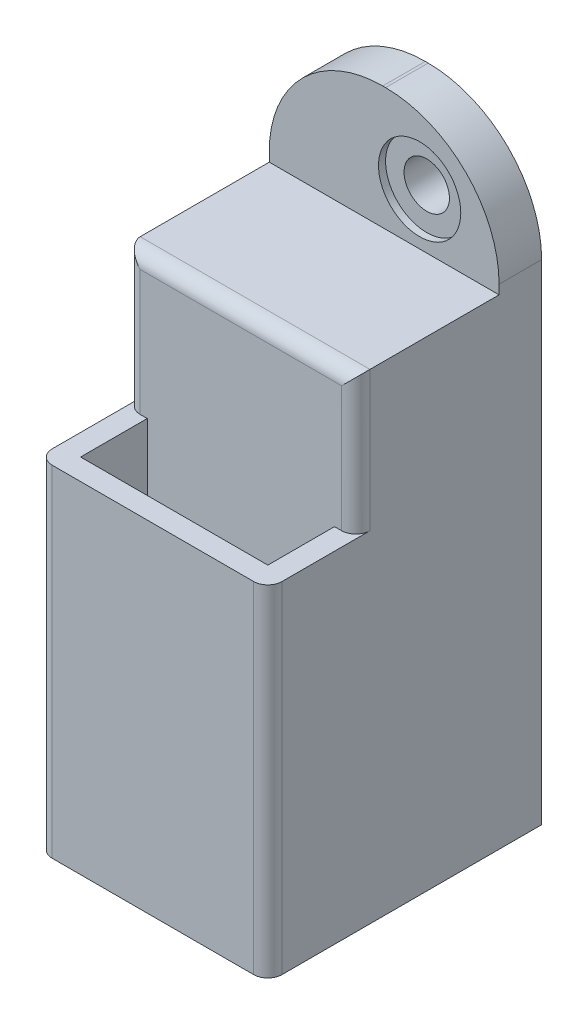
ISO-10303-21;
HEADER;
FILE_DESCRIPTION(('STEP AP214'),'2;1');
FILE_NAME('part.step','',(''),(''),'','','');
FILE_SCHEMA(('AUTOMOTIVE_DESIGN { 1 0 10303 214 1 1 1 1 }'));
ENDSEC;
DATA;
#1=APPLICATION_CONTEXT('core data for automotive mechanical design processes');
#2=APPLICATION_PROTOCOL_DEFINITION('international standard','automotive_design',2000,#1);
#3=PRODUCT_CONTEXT('',#1,'mechanical');
#4=PRODUCT('Part','Part','',(#3));
#5=PRODUCT_RELATED_PRODUCT_CATEGORY('part','',(#4));
#6=PRODUCT_DEFINITION_FORMATION('','',#4);
#7=PRODUCT_DEFINITION_CONTEXT('part definition',#1,'design');
#8=PRODUCT_DEFINITION('design','',#6,#7);
#9=PRODUCT_DEFINITION_SHAPE('','',#8);
#10=(LENGTH_UNIT() NAMED_UNIT(*) SI_UNIT(.MILLI.,.METRE.));
#11=(NAMED_UNIT(*) PLANE_ANGLE_UNIT() SI_UNIT($,.RADIAN.));
#12=(NAMED_UNIT(*) SI_UNIT($,.STERADIAN.) SOLID_ANGLE_UNIT());
#13=UNCERTAINTY_MEASURE_WITH_UNIT(LENGTH_MEASURE(1.E-05),#10,'distance_accuracy_value','');
#14=(GEOMETRIC_REPRESENTATION_CONTEXT(3) GLOBAL_UNCERTAINTY_ASSIGNED_CONTEXT((#13)) GLOBAL_UNIT_ASSIGNED_CONTEXT((#10,
#11,#12)) REPRESENTATION_CONTEXT('',''));
#15=CARTESIAN_POINT('',(0.,0.,0.));
#16=DIRECTION('',(0.,0.,1.));
#17=DIRECTION('',(1.,0.,0.));
#18=AXIS2_PLACEMENT_3D('',#15,#16,#17);
#19=CARTESIAN_POINT('',(0.,0.,-3.5));
#20=DIRECTION('',(0.,0.,-1.));
#21=DIRECTION('',(-1.,0.,0.));
#22=AXIS2_PLACEMENT_3D('',#19,#20,#21);
#23=PLANE('',#22);
#24=DIRECTION('',(0.,-1.,0.));
#25=VECTOR('',#24,1.);
#26=CARTESIAN_POINT('',(0.3,0.,-3.5));
#27=LINE('',#26,#25);
#28=CARTESIAN_POINT('',(0.3,15.,-3.5));
#29=VERTEX_POINT('',#28);
#30=CARTESIAN_POINT('',(0.3,-17.5,-3.5));
#31=VERTEX_POINT('',#30);
#32=EDGE_CURVE('E320',#29,#31,#27,.T.);
#33=ORIENTED_EDGE('',*,*,#32,.F.);
#34=DIRECTION('',(-1.,0.,0.));
#35=VECTOR('',#34,1.);
#36=CARTESIAN_POINT('',(12.9,15.,-3.5));
#37=LINE('',#36,#35);
#38=CARTESIAN_POINT('',(12.9,15.,-3.5));
#39=VERTEX_POINT('',#38);
#40=EDGE_CURVE('E215',#39,#29,#37,.T.);
#41=ORIENTED_EDGE('',*,*,#40,.F.);
#42=DIRECTION('',(0.,1.,0.));
#43=VECTOR('',#42,1.);
#44=CARTESIAN_POINT('',(12.9,11.,-3.5));
#45=LINE('',#44,#43);
#46=CARTESIAN_POINT('',(12.9,-17.5,-3.5));
#47=VERTEX_POINT('',#46);
#48=EDGE_CURVE('E315',#47,#39,#45,.T.);
#49=ORIENTED_EDGE('',*,*,#48,.F.);
#50=DIRECTION('',(1.,0.,0.));
#51=VECTOR('',#50,1.);
#52=CARTESIAN_POINT('',(0.3,-17.5,-3.5));
#53=LINE('',#52,#51);
#54=EDGE_CURVE('E273',#31,#47,#53,.T.);
#55=ORIENTED_EDGE('',*,*,#54,.F.);
#56=EDGE_LOOP('',(#33,#41,#49,#55));
#57=FACE_BOUND('',#56,.T.);
#58=ADVANCED_FACE('F33',(#57),#23,.T.);
#59=CARTESIAN_POINT('',(12.9,11.,-11.6));
#60=DIRECTION('',(1.,0.,0.));
#61=DIRECTION('',(0.,1.,0.));
#62=AXIS2_PLACEMENT_3D('',#59,#60,#61);
#63=PLANE('',#62);
#64=DIRECTION('',(0.,0.,-1.));
#65=VECTOR('',#64,1.);
#66=CARTESIAN_POINT('',(12.9,15.,10.6777995471794));
#67=LINE('',#66,#65);
#68=CARTESIAN_POINT('',(12.9,15.,-11.6));
#69=VERTEX_POINT('',#68);
#70=EDGE_CURVE('E216',#39,#69,#67,.T.);
#71=ORIENTED_EDGE('',*,*,#70,.T.);
#72=DIRECTION('',(0.,1.,0.));
#73=VECTOR('',#72,1.);
#74=CARTESIAN_POINT('',(12.9,11.,-11.6));
#75=LINE('',#74,#73);
#76=CARTESIAN_POINT('',(12.9,-17.5,-11.6));
#77=VERTEX_POINT('',#76);
#78=EDGE_CURVE('E206',#77,#69,#75,.T.);
#79=ORIENTED_EDGE('',*,*,#78,.F.);
#80=DIRECTION('',(0.,0.,-1.));
#81=VECTOR('',#80,1.);
#82=CARTESIAN_POINT('',(12.9,-17.5,-3.5));
#83=LINE('',#82,#81);
#84=EDGE_CURVE('E276',#47,#77,#83,.T.);
#85=ORIENTED_EDGE('',*,*,#84,.F.);
#86=ORIENTED_EDGE('',*,*,#48,.T.);
#87=EDGE_LOOP('',(#71,#79,#85,#86));
#88=FACE_BOUND('',#87,.T.);
#89=ADVANCED_FACE('F491',(#88),#63,.F.);
#90=CARTESIAN_POINT('',(0.3,0.,-11.6));
#91=DIRECTION('',(-1.,0.,0.));
#92=DIRECTION('',(0.,0.,1.));
#93=AXIS2_PLACEMENT_3D('',#90,#91,#92);
#94=PLANE('',#93);
#95=DIRECTION('',(0.,0.,1.));
#96=VECTOR('',#95,1.);
#97=CARTESIAN_POINT('',(0.3,-17.5,-11.6));
#98=LINE('',#97,#96);
#99=CARTESIAN_POINT('',(0.3,-17.5,-11.6));
#100=VERTEX_POINT('',#99);
#101=EDGE_CURVE('E200',#100,#31,#98,.T.);
#102=ORIENTED_EDGE('',*,*,#101,.F.);
#103=DIRECTION('',(0.,-1.,0.));
#104=VECTOR('',#103,1.);
#105=CARTESIAN_POINT('',(0.3,0.,-11.6));
#106=LINE('',#105,#104);
#107=CARTESIAN_POINT('',(0.3,15.,-11.6));
#108=VERTEX_POINT('',#107);
#109=EDGE_CURVE('E195',#108,#100,#106,.T.);
#110=ORIENTED_EDGE('',*,*,#109,.F.);
#111=DIRECTION('',(0.,0.,-1.));
#112=VECTOR('',#111,1.);
#113=CARTESIAN_POINT('',(0.3,15.,10.6777995471794));
#114=LINE('',#113,#112);
#115=EDGE_CURVE('E198',#29,#108,#114,.T.);
#116=ORIENTED_EDGE('',*,*,#115,.F.);
#117=ORIENTED_EDGE('',*,*,#32,.T.);
#118=EDGE_LOOP('',(#102,#110,#116,#117));
#119=FACE_BOUND('',#118,.T.);
#120=ADVANCED_FACE('F197',(#119),#94,.F.);
#121=CARTESIAN_POINT('',(14.7,25.,-8.6));
#122=DIRECTION('',(0.,0.,-1.));
#123=DIRECTION('',(-1.,0.,0.));
#124=AXIS2_PLACEMENT_3D('',#121,#122,#123);
#125=PLANE('',#124);
#126=CARTESIAN_POINT('',(9.1,20.,-8.6));
#127=DIRECTION('',(0.,0.,1.));
#128=DIRECTION('',(1.,0.,0.));
#129=AXIS2_PLACEMENT_3D('',#126,#127,#128);
#130=CIRCLE('',#129,2.9);
#131=CARTESIAN_POINT('',(12.,20.,-8.6));
#132=VERTEX_POINT('',#131);
#133=EDGE_CURVE('E290',#132,#132,#130,.T.);
#134=ORIENTED_EDGE('',*,*,#133,.F.);
#135=EDGE_LOOP('',(#134));
#136=FACE_BOUND('',#135,.T.);
#137=DIRECTION('',(-1.,0.,0.));
#138=VECTOR('',#137,1.);
#139=CARTESIAN_POINT('',(14.7,16.35,-8.6));
#140=LINE('',#139,#138);
#141=CARTESIAN_POINT('',(14.7,16.35,-8.6));
#142=VERTEX_POINT('',#141);
#143=CARTESIAN_POINT('',(-1.5,16.35,-8.6));
#144=VERTEX_POINT('',#143);
#145=EDGE_CURVE('E227',#142,#144,#140,.T.);
#146=ORIENTED_EDGE('',*,*,#145,.F.);
#147=DIRECTION('',(0.,-1.,0.));
#148=VECTOR('',#147,1.);
#149=CARTESIAN_POINT('',(14.7,25.,-8.6));
#150=LINE('',#149,#148);
#151=CARTESIAN_POINT('',(14.7,17.,-8.6));
#152=VERTEX_POINT('',#151);
#153=EDGE_CURVE('E309',#152,#142,#150,.T.);
#154=ORIENTED_EDGE('',*,*,#153,.F.);
#155=CARTESIAN_POINT('',(6.7,17.,-8.6));
#156=DIRECTION('',(0.,0.,-1.));
#157=DIRECTION('',(-1.,0.,0.));
#158=AXIS2_PLACEMENT_3D('',#155,#156,#157);
#159=CIRCLE('',#158,8.);
#160=CARTESIAN_POINT('',(6.7,25.,-8.6));
#161=VERTEX_POINT('',#160);
#162=EDGE_CURVE('E372',#152,#161,#159,.F.);
#163=ORIENTED_EDGE('',*,*,#162,.T.);
#164=DIRECTION('',(1.,0.,0.));
#165=VECTOR('',#164,1.);
#166=CARTESIAN_POINT('',(14.7,25.,-8.6));
#167=LINE('',#166,#165);
#168=CARTESIAN_POINT('',(6.5,25.,-8.6));
#169=VERTEX_POINT('',#168);
#170=EDGE_CURVE('E306',#169,#161,#167,.T.);
#171=ORIENTED_EDGE('',*,*,#170,.F.);
#172=CARTESIAN_POINT('',(6.5,17.,-8.6));
#173=DIRECTION('',(0.,0.,-1.));
#174=DIRECTION('',(-1.,0.,0.));
#175=AXIS2_PLACEMENT_3D('',#172,#173,#174);
#176=CIRCLE('',#175,8.);
#177=CARTESIAN_POINT('',(-1.5,17.,-8.6));
#178=VERTEX_POINT('',#177);
#179=EDGE_CURVE('E370',#169,#178,#176,.F.);
#180=ORIENTED_EDGE('',*,*,#179,.T.);
#181=DIRECTION('',(0.,-1.,0.));
#182=VECTOR('',#181,1.);
#183=CARTESIAN_POINT('',(-1.5,25.,-8.6));
#184=LINE('',#183,#182);
#185=EDGE_CURVE('E312',#178,#144,#184,.T.);
#186=ORIENTED_EDGE('',*,*,#185,.T.);
#187=EDGE_LOOP('',(#146,#154,#163,#171,#180,#186));
#188=FACE_BOUND('',#187,.T.);
#189=ADVANCED_FACE('F419',(#136,#188),#125,.F.);
#190=CARTESIAN_POINT('',(0.,6.5,0.));
#191=DIRECTION('',(1.,0.,0.));
#192=DIRECTION('',(0.,0.,-1.));
#193=AXIS2_PLACEMENT_3D('',#190,#191,#192);
#194=PLANE('',#193);
#195=DIRECTION('',(0.,0.,-1.));
#196=VECTOR('',#195,1.);
#197=CARTESIAN_POINT('',(0.,-11.,1.5));
#198=LINE('',#197,#196);
#199=CARTESIAN_POINT('',(0.,-11.,1.5));
#200=VERTEX_POINT('',#199);
#201=CARTESIAN_POINT('',(0.,-11.,0.));
#202=VERTEX_POINT('',#201);
#203=EDGE_CURVE('E240',#200,#202,#198,.T.);
#204=ORIENTED_EDGE('',*,*,#203,.F.);
#205=DIRECTION('',(0.,1.,0.));
#206=VECTOR('',#205,1.);
#207=CARTESIAN_POINT('',(0.,3.,1.5));
#208=LINE('',#207,#206);
#209=CARTESIAN_POINT('',(0.,6.5,1.5));
#210=VERTEX_POINT('',#209);
#211=EDGE_CURVE('E287',#200,#210,#208,.T.);
#212=ORIENTED_EDGE('',*,*,#211,.T.);
#213=DIRECTION('',(0.,0.,1.));
#214=VECTOR('',#213,1.);
#215=CARTESIAN_POINT('',(0.,6.5,0.));
#216=LINE('',#215,#214);
#217=CARTESIAN_POINT('',(0.,6.5,6.2));
#218=VERTEX_POINT('',#217);
#219=EDGE_CURVE('E205',#210,#218,#216,.T.);
#220=ORIENTED_EDGE('',*,*,#219,.T.);
#221=DIRECTION('',(0.,-1.,0.));
#222=VECTOR('',#221,1.);
#223=CARTESIAN_POINT('',(0.,6.5,6.2));
#224=LINE('',#223,#222);
#225=CARTESIAN_POINT('',(0.,-17.5,6.2));
#226=VERTEX_POINT('',#225);
#227=EDGE_CURVE('E337',#218,#226,#224,.T.);
#228=ORIENTED_EDGE('',*,*,#227,.T.);
#229=DIRECTION('',(0.,0.,-1.));
#230=VECTOR('',#229,1.);
#231=CARTESIAN_POINT('',(0.,-17.5,6.2));
#232=LINE('',#231,#230);
#233=CARTESIAN_POINT('',(0.,-17.5,0.));
#234=VERTEX_POINT('',#233);
#235=EDGE_CURVE('E249',#226,#234,#232,.T.);
#236=ORIENTED_EDGE('',*,*,#235,.T.);
#237=DIRECTION('',(0.,-1.,0.));
#238=VECTOR('',#237,1.);
#239=CARTESIAN_POINT('',(0.,6.5,0.));
#240=LINE('',#239,#238);
#241=EDGE_CURVE('E331',#202,#234,#240,.T.);
#242=ORIENTED_EDGE('',*,*,#241,.F.);
#243=EDGE_LOOP('',(#204,#212,#220,#228,#236,#242));
#244=FACE_BOUND('',#243,.T.);
#245=ADVANCED_FACE('F461',(#244),#194,.T.);
#246=CARTESIAN_POINT('',(13.2,6.5,0.));
#247=DIRECTION('',(-1.,0.,0.));
#248=DIRECTION('',(0.,0.,1.));
#249=AXIS2_PLACEMENT_3D('',#246,#247,#248);
#250=PLANE('',#249);
#251=DIRECTION('',(0.,1.,0.));
#252=VECTOR('',#251,1.);
#253=CARTESIAN_POINT('',(13.2,3.,1.5));
#254=LINE('',#253,#252);
#255=CARTESIAN_POINT('',(13.2,-11.,1.5));
#256=VERTEX_POINT('',#255);
#257=CARTESIAN_POINT('',(13.2,6.5,1.5));
#258=VERTEX_POINT('',#257);
#259=EDGE_CURVE('E285',#256,#258,#254,.T.);
#260=ORIENTED_EDGE('',*,*,#259,.F.);
#261=DIRECTION('',(0.,0.,1.));
#262=VECTOR('',#261,1.);
#263=CARTESIAN_POINT('',(13.2,-11.,0.));
#264=LINE('',#263,#262);
#265=CARTESIAN_POINT('',(13.2,-11.,0.));
#266=VERTEX_POINT('',#265);
#267=EDGE_CURVE('E234',#266,#256,#264,.T.);
#268=ORIENTED_EDGE('',*,*,#267,.F.);
#269=DIRECTION('',(0.,-1.,0.));
#270=VECTOR('',#269,1.);
#271=CARTESIAN_POINT('',(13.2,6.5,0.));
#272=LINE('',#271,#270);
#273=CARTESIAN_POINT('',(13.2,-17.5,0.));
#274=VERTEX_POINT('',#273);
#275=EDGE_CURVE('E333',#266,#274,#272,.T.);
#276=ORIENTED_EDGE('',*,*,#275,.T.);
#277=DIRECTION('',(0.,0.,1.));
#278=VECTOR('',#277,1.);
#279=CARTESIAN_POINT('',(13.2,-17.5,0.));
#280=LINE('',#279,#278);
#281=CARTESIAN_POINT('',(13.2,-17.5,6.2));
#282=VERTEX_POINT('',#281);
#283=EDGE_CURVE('E255',#274,#282,#280,.T.);
#284=ORIENTED_EDGE('',*,*,#283,.T.);
#285=DIRECTION('',(0.,-1.,0.));
#286=VECTOR('',#285,1.);
#287=CARTESIAN_POINT('',(13.2,6.5,6.2));
#288=LINE('',#287,#286);
#289=CARTESIAN_POINT('',(13.2,6.5,6.2));
#290=VERTEX_POINT('',#289);
#291=EDGE_CURVE('E335',#290,#282,#288,.T.);
#292=ORIENTED_EDGE('',*,*,#291,.F.);
#293=DIRECTION('',(0.,0.,-1.));
#294=VECTOR('',#293,1.);
#295=CARTESIAN_POINT('',(13.2,6.5,0.));
#296=LINE('',#295,#294);
#297=EDGE_CURVE('E328',#290,#258,#296,.T.);
#298=ORIENTED_EDGE('',*,*,#297,.T.);
#299=EDGE_LOOP('',(#260,#268,#276,#284,#292,#298));
#300=FACE_BOUND('',#299,.T.);
#301=ADVANCED_FACE('F469',(#300),#250,.T.);
#302=CARTESIAN_POINT('',(9.1,20.,-16.1254833995939));
#303=DIRECTION('',(0.,0.,1.));
#304=DIRECTION('',(1.,0.,0.));
#305=AXIS2_PLACEMENT_3D('',#302,#303,#304);
#306=CYLINDRICAL_SURFACE('',#305,1.6);
#307=CARTESIAN_POINT('',(9.1,20.,-11.6));
#308=DIRECTION('',(0.,0.,1.));
#309=DIRECTION('',(1.,0.,0.));
#310=AXIS2_PLACEMENT_3D('',#307,#308,#309);
#311=CIRCLE('',#310,1.6);
#312=CARTESIAN_POINT('',(10.7,20.,-11.6));
#313=VERTEX_POINT('',#312);
#314=EDGE_CURVE('E299',#313,#313,#311,.F.);
#315=ORIENTED_EDGE('',*,*,#314,.T.);
#316=EDGE_LOOP('',(#315));
#317=FACE_BOUND('',#316,.T.);
#318=CARTESIAN_POINT('',(9.1,20.,-9.1));
#319=DIRECTION('',(0.,0.,1.));
#320=DIRECTION('',(1.,0.,0.));
#321=AXIS2_PLACEMENT_3D('',#318,#319,#320);
#322=CIRCLE('',#321,1.6);
#323=CARTESIAN_POINT('',(10.7,20.,-9.1));
#324=VERTEX_POINT('',#323);
#325=EDGE_CURVE('E294',#324,#324,#322,.F.);
#326=ORIENTED_EDGE('',*,*,#325,.F.);
#327=EDGE_LOOP('',(#326));
#328=FACE_BOUND('',#327,.T.);
#329=ADVANCED_FACE('F506',(#317,#328),#306,.F.);
#330=CARTESIAN_POINT('',(0.,6.5,0.));
#331=DIRECTION('',(0.,1.,0.));
#332=DIRECTION('',(0.,0.,1.));
#333=AXIS2_PLACEMENT_3D('',#330,#331,#332);
#334=PLANE('',#333);
#335=DIRECTION('',(0.,0.,1.));
#336=VECTOR('',#335,1.);
#337=CARTESIAN_POINT('',(-1.5,6.5,-1.5));
#338=LINE('',#337,#336);
#339=CARTESIAN_POINT('',(-1.5,6.5,0.5));
#340=VERTEX_POINT('',#339);
#341=CARTESIAN_POINT('',(-1.5,6.5,6.7));
#342=VERTEX_POINT('',#341);
#343=EDGE_CURVE('E57',#340,#342,#338,.T.);
#344=ORIENTED_EDGE('',*,*,#343,.T.);
#345=CARTESIAN_POINT('',(-0.5,6.5,6.7));
#346=DIRECTION('',(0.,1.,0.));
#347=DIRECTION('',(0.,0.,1.));
#348=AXIS2_PLACEMENT_3D('',#345,#346,#347);
#349=CIRCLE('',#348,1.);
#350=CARTESIAN_POINT('',(-0.5,6.5,7.7));
#351=VERTEX_POINT('',#350);
#352=EDGE_CURVE('E354',#342,#351,#349,.T.);
#353=ORIENTED_EDGE('',*,*,#352,.T.);
#354=DIRECTION('',(1.,0.,0.));
#355=VECTOR('',#354,1.);
#356=CARTESIAN_POINT('',(-1.5,6.5,7.7));
#357=LINE('',#356,#355);
#358=CARTESIAN_POINT('',(13.7,6.5,7.7));
#359=VERTEX_POINT('',#358);
#360=EDGE_CURVE('E340',#351,#359,#357,.T.);
#361=ORIENTED_EDGE('',*,*,#360,.T.);
#362=CARTESIAN_POINT('',(13.7,6.5,6.7));
#363=DIRECTION('',(0.,1.,0.));
#364=DIRECTION('',(0.,0.,1.));
#365=AXIS2_PLACEMENT_3D('',#362,#363,#364);
#366=CIRCLE('',#365,1.);
#367=CARTESIAN_POINT('',(14.7,6.5,6.7));
#368=VERTEX_POINT('',#367);
#369=EDGE_CURVE('E352',#359,#368,#366,.T.);
#370=ORIENTED_EDGE('',*,*,#369,.T.);
#371=DIRECTION('',(0.,0.,-1.));
#372=VECTOR('',#371,1.);
#373=CARTESIAN_POINT('',(14.7,6.5,-1.5));
#374=LINE('',#373,#372);
#375=CARTESIAN_POINT('',(14.7,6.5,0.5));
#376=VERTEX_POINT('',#375);
#377=EDGE_CURVE('E49',#368,#376,#374,.T.);
#378=ORIENTED_EDGE('',*,*,#377,.T.);
#379=CARTESIAN_POINT('',(13.7,6.5,0.5));
#380=DIRECTION('',(0.,1.,0.));
#381=DIRECTION('',(0.,0.,1.));
#382=AXIS2_PLACEMENT_3D('',#379,#380,#381);
#383=CIRCLE('',#382,1.);
#384=CARTESIAN_POINT('',(13.7,6.5,1.5));
#385=VERTEX_POINT('',#384);
#386=EDGE_CURVE('E11',#376,#385,#383,.F.);
#387=ORIENTED_EDGE('',*,*,#386,.T.);
#388=DIRECTION('',(1.,0.,0.));
#389=VECTOR('',#388,1.);
#390=CARTESIAN_POINT('',(14.7,6.5,1.5));
#391=LINE('',#390,#389);
#392=EDGE_CURVE('E300',#258,#385,#391,.T.);
#393=ORIENTED_EDGE('',*,*,#392,.F.);
#394=ORIENTED_EDGE('',*,*,#297,.F.);
#395=DIRECTION('',(1.,0.,0.));
#396=VECTOR('',#395,1.);
#397=CARTESIAN_POINT('',(0.,6.5,6.2));
#398=LINE('',#397,#396);
#399=EDGE_CURVE('E326',#218,#290,#398,.T.);
#400=ORIENTED_EDGE('',*,*,#399,.F.);
#401=ORIENTED_EDGE('',*,*,#219,.F.);
#402=CARTESIAN_POINT('',(-0.5,6.5,1.5));
#403=VERTEX_POINT('',#402);
#404=EDGE_CURVE('E297',#403,#210,#391,.T.);
#405=ORIENTED_EDGE('',*,*,#404,.F.);
#406=CARTESIAN_POINT('',(-0.5,6.5,0.5));
#407=DIRECTION('',(0.,1.,0.));
#408=DIRECTION('',(0.,0.,1.));
#409=AXIS2_PLACEMENT_3D('',#406,#407,#408);
#410=CIRCLE('',#409,1.);
#411=EDGE_CURVE('E42',#403,#340,#410,.F.);
#412=ORIENTED_EDGE('',*,*,#411,.T.);
#413=EDGE_LOOP('',(#344,#353,#361,#370,#378,#387,#393,#394,#400,#401,#405,#412));
#414=FACE_BOUND('',#413,.T.);
#415=ADVANCED_FACE('F455',(#414),#334,.T.);
#416=CARTESIAN_POINT('',(-1.5,6.5,-1.5));
#417=DIRECTION('',(1.,0.,0.));
#418=DIRECTION('',(0.,0.,-1.));
#419=AXIS2_PLACEMENT_3D('',#416,#417,#418);
#420=PLANE('',#419);
#421=ORIENTED_EDGE('',*,*,#343,.F.);
#422=DIRECTION('',(0.,-1.,0.));
#423=VECTOR('',#422,1.);
#424=CARTESIAN_POINT('',(-1.5,16.35,0.5));
#425=LINE('',#424,#423);
#426=CARTESIAN_POINT('',(-1.5,16.35,0.5));
#427=VERTEX_POINT('',#426);
#428=EDGE_CURVE('E385',#340,#427,#425,.F.);
#429=ORIENTED_EDGE('',*,*,#428,.T.);
#430=DIRECTION('',(0.,0.,-1.));
#431=VECTOR('',#430,1.);
#432=CARTESIAN_POINT('',(-1.5,16.35,19.5017360273947));
#433=LINE('',#432,#431);
#434=EDGE_CURVE('E230',#427,#144,#433,.T.);
#435=ORIENTED_EDGE('',*,*,#434,.T.);
#436=ORIENTED_EDGE('',*,*,#185,.F.);
#437=DIRECTION('',(0.,0.,1.));
#438=VECTOR('',#437,1.);
#439=CARTESIAN_POINT('',(-1.5,17.,-1.5));
#440=LINE('',#439,#438);
#441=CARTESIAN_POINT('',(-1.5,17.,-11.6));
#442=VERTEX_POINT('',#441);
#443=EDGE_CURVE('E374',#178,#442,#440,.F.);
#444=ORIENTED_EDGE('',*,*,#443,.T.);
#445=DIRECTION('',(0.,1.,0.));
#446=VECTOR('',#445,1.);
#447=CARTESIAN_POINT('',(-1.5,0.,-11.6));
#448=LINE('',#447,#446);
#449=CARTESIAN_POINT('',(-1.5,-17.5,-11.6));
#450=VERTEX_POINT('',#449);
#451=EDGE_CURVE('E316',#450,#442,#448,.T.);
#452=ORIENTED_EDGE('',*,*,#451,.F.);
#453=DIRECTION('',(0.,0.,-1.));
#454=VECTOR('',#453,1.);
#455=CARTESIAN_POINT('',(-1.5,-17.5,6.7));
#456=LINE('',#455,#454);
#457=CARTESIAN_POINT('',(-1.5,-17.5,6.7));
#458=VERTEX_POINT('',#457);
#459=EDGE_CURVE('E267',#458,#450,#456,.T.);
#460=ORIENTED_EDGE('',*,*,#459,.F.);
#461=DIRECTION('',(0.,-1.,0.));
#462=VECTOR('',#461,1.);
#463=CARTESIAN_POINT('',(-1.5,6.5,6.7));
#464=LINE('',#463,#462);
#465=EDGE_CURVE('E350',#458,#342,#464,.F.);
#466=ORIENTED_EDGE('',*,*,#465,.T.);
#467=EDGE_LOOP('',(#421,#429,#435,#436,#444,#452,#460,#466));
#468=FACE_BOUND('',#467,.T.);
#469=ADVANCED_FACE('F424',(#468),#420,.F.);
#470=CARTESIAN_POINT('',(-1.5,6.5,7.7));
#471=DIRECTION('',(0.,0.,-1.));
#472=DIRECTION('',(-1.,0.,0.));
#473=AXIS2_PLACEMENT_3D('',#470,#471,#472);
#474=PLANE('',#473);
#475=ORIENTED_EDGE('',*,*,#360,.F.);
#476=DIRECTION('',(0.,-1.,0.));
#477=VECTOR('',#476,1.);
#478=CARTESIAN_POINT('',(-0.5,6.5,7.7));
#479=LINE('',#478,#477);
#480=CARTESIAN_POINT('',(-0.5,-17.5,7.7));
#481=VERTEX_POINT('',#480);
#482=EDGE_CURVE('E348',#351,#481,#479,.T.);
#483=ORIENTED_EDGE('',*,*,#482,.T.);
#484=DIRECTION('',(-1.,0.,0.));
#485=VECTOR('',#484,1.);
#486=CARTESIAN_POINT('',(13.7,-17.5,7.7));
#487=LINE('',#486,#485);
#488=CARTESIAN_POINT('',(13.7,-17.5,7.7));
#489=VERTEX_POINT('',#488);
#490=EDGE_CURVE('E261',#489,#481,#487,.T.);
#491=ORIENTED_EDGE('',*,*,#490,.F.);
#492=DIRECTION('',(0.,-1.,0.));
#493=VECTOR('',#492,1.);
#494=CARTESIAN_POINT('',(13.7,6.5,7.7));
#495=LINE('',#494,#493);
#496=EDGE_CURVE('E344',#489,#359,#495,.F.);
#497=ORIENTED_EDGE('',*,*,#496,.T.);
#498=EDGE_LOOP('',(#475,#483,#491,#497));
#499=FACE_BOUND('',#498,.T.);
#500=ADVANCED_FACE('F448',(#499),#474,.F.);
#501=CARTESIAN_POINT('',(14.7,6.5,-1.5));
#502=DIRECTION('',(-1.,0.,0.));
#503=DIRECTION('',(0.,0.,1.));
#504=AXIS2_PLACEMENT_3D('',#501,#502,#503);
#505=PLANE('',#504);
#506=DIRECTION('',(0.,0.,-1.));
#507=VECTOR('',#506,1.);
#508=CARTESIAN_POINT('',(14.7,16.35,19.5017360273947));
#509=LINE('',#508,#507);
#510=CARTESIAN_POINT('',(14.7,16.35,0.5));
#511=VERTEX_POINT('',#510);
#512=EDGE_CURVE('E231',#511,#142,#509,.T.);
#513=ORIENTED_EDGE('',*,*,#512,.F.);
#514=DIRECTION('',(0.,1.,0.));
#515=VECTOR('',#514,1.);
#516=CARTESIAN_POINT('',(14.7,6.5,0.5));
#517=LINE('',#516,#515);
#518=EDGE_CURVE('E387',#511,#376,#517,.F.);
#519=ORIENTED_EDGE('',*,*,#518,.T.);
#520=ORIENTED_EDGE('',*,*,#377,.F.);
#521=DIRECTION('',(0.,-1.,0.));
#522=VECTOR('',#521,1.);
#523=CARTESIAN_POINT('',(14.7,6.5,6.7));
#524=LINE('',#523,#522);
#525=CARTESIAN_POINT('',(14.7,-17.5,6.7));
#526=VERTEX_POINT('',#525);
#527=EDGE_CURVE('E356',#368,#526,#524,.T.);
#528=ORIENTED_EDGE('',*,*,#527,.T.);
#529=DIRECTION('',(0.,0.,1.));
#530=VECTOR('',#529,1.);
#531=CARTESIAN_POINT('',(14.7,-17.5,-11.6));
#532=LINE('',#531,#530);
#533=CARTESIAN_POINT('',(14.7,-17.5,-11.6));
#534=VERTEX_POINT('',#533);
#535=EDGE_CURVE('E282',#534,#526,#532,.T.);
#536=ORIENTED_EDGE('',*,*,#535,.F.);
#537=DIRECTION('',(0.,-1.,0.));
#538=VECTOR('',#537,1.);
#539=CARTESIAN_POINT('',(14.7,12.,-11.6));
#540=LINE('',#539,#538);
#541=CARTESIAN_POINT('',(14.7,17.,-11.6));
#542=VERTEX_POINT('',#541);
#543=EDGE_CURVE('E319',#542,#534,#540,.T.);
#544=ORIENTED_EDGE('',*,*,#543,.F.);
#545=DIRECTION('',(0.,0.,-1.));
#546=VECTOR('',#545,1.);
#547=CARTESIAN_POINT('',(14.7,17.,-1.5));
#548=LINE('',#547,#546);
#549=EDGE_CURVE('E368',#542,#152,#548,.F.);
#550=ORIENTED_EDGE('',*,*,#549,.T.);
#551=ORIENTED_EDGE('',*,*,#153,.T.);
#552=EDGE_LOOP('',(#513,#519,#520,#528,#536,#544,#550,#551));
#553=FACE_BOUND('',#552,.T.);
#554=ADVANCED_FACE('F411',(#553),#505,.F.);
#555=CARTESIAN_POINT('',(0.,6.5,6.2));
#556=DIRECTION('',(0.,0.,-1.));
#557=DIRECTION('',(-1.,0.,0.));
#558=AXIS2_PLACEMENT_3D('',#555,#556,#557);
#559=PLANE('',#558);
#560=ORIENTED_EDGE('',*,*,#291,.T.);
#561=DIRECTION('',(-1.,0.,0.));
#562=VECTOR('',#561,1.);
#563=CARTESIAN_POINT('',(13.2,-17.5,6.2));
#564=LINE('',#563,#562);
#565=EDGE_CURVE('E246',#282,#226,#564,.T.);
#566=ORIENTED_EDGE('',*,*,#565,.T.);
#567=ORIENTED_EDGE('',*,*,#227,.F.);
#568=ORIENTED_EDGE('',*,*,#399,.T.);
#569=EDGE_LOOP('',(#560,#566,#567,#568));
#570=FACE_BOUND('',#569,.T.);
#571=ADVANCED_FACE('F473',(#570),#559,.T.);
#572=CARTESIAN_POINT('',(0.,6.5,0.));
#573=DIRECTION('',(0.,0.,1.));
#574=DIRECTION('',(1.,0.,0.));
#575=AXIS2_PLACEMENT_3D('',#572,#573,#574);
#576=PLANE('',#575);
#577=DIRECTION('',(1.,0.,0.));
#578=VECTOR('',#577,1.);
#579=CARTESIAN_POINT('',(0.,-11.,0.));
#580=LINE('',#579,#578);
#581=EDGE_CURVE('E243',#202,#266,#580,.T.);
#582=ORIENTED_EDGE('',*,*,#581,.F.);
#583=ORIENTED_EDGE('',*,*,#241,.T.);
#584=DIRECTION('',(1.,0.,0.));
#585=VECTOR('',#584,1.);
#586=CARTESIAN_POINT('',(0.,-17.5,0.));
#587=LINE('',#586,#585);
#588=EDGE_CURVE('E252',#234,#274,#587,.T.);
#589=ORIENTED_EDGE('',*,*,#588,.T.);
#590=ORIENTED_EDGE('',*,*,#275,.F.);
#591=EDGE_LOOP('',(#582,#583,#589,#590));
#592=FACE_BOUND('',#591,.T.);
#593=ADVANCED_FACE('F478',(#592),#576,.T.);
#594=CARTESIAN_POINT('',(0.,0.,-11.6));
#595=DIRECTION('',(0.,0.,1.));
#596=DIRECTION('',(1.,0.,0.));
#597=AXIS2_PLACEMENT_3D('',#594,#595,#596);
#598=PLANE('',#597);
#599=ORIENTED_EDGE('',*,*,#314,.F.);
#600=EDGE_LOOP('',(#599));
#601=FACE_BOUND('',#600,.T.);
#602=ORIENTED_EDGE('',*,*,#78,.T.);
#603=DIRECTION('',(1.,0.,0.));
#604=VECTOR('',#603,1.);
#605=CARTESIAN_POINT('',(12.9,15.,-11.6));
#606=LINE('',#605,#604);
#607=EDGE_CURVE('E213',#108,#69,#606,.T.);
#608=ORIENTED_EDGE('',*,*,#607,.F.);
#609=ORIENTED_EDGE('',*,*,#109,.T.);
#610=DIRECTION('',(1.,0.,0.));
#611=VECTOR('',#610,1.);
#612=CARTESIAN_POINT('',(-1.5,-17.5,-11.6));
#613=LINE('',#612,#611);
#614=EDGE_CURVE('E270',#450,#100,#613,.T.);
#615=ORIENTED_EDGE('',*,*,#614,.F.);
#616=ORIENTED_EDGE('',*,*,#451,.T.);
#617=CARTESIAN_POINT('',(6.5,17.,-11.6));
#618=DIRECTION('',(0.,0.,1.));
#619=DIRECTION('',(1.,0.,0.));
#620=AXIS2_PLACEMENT_3D('',#617,#618,#619);
#621=CIRCLE('',#620,8.);
#622=CARTESIAN_POINT('',(6.5,25.,-11.6));
#623=VERTEX_POINT('',#622);
#624=EDGE_CURVE('E364',#442,#623,#621,.F.);
#625=ORIENTED_EDGE('',*,*,#624,.T.);
#626=DIRECTION('',(-1.,0.,0.));
#627=VECTOR('',#626,1.);
#628=CARTESIAN_POINT('',(14.7,25.,-11.6));
#629=LINE('',#628,#627);
#630=CARTESIAN_POINT('',(6.7,25.,-11.6));
#631=VERTEX_POINT('',#630);
#632=EDGE_CURVE('E303',#631,#623,#629,.T.);
#633=ORIENTED_EDGE('',*,*,#632,.F.);
#634=CARTESIAN_POINT('',(6.7,17.,-11.6));
#635=DIRECTION('',(0.,0.,1.));
#636=DIRECTION('',(1.,0.,0.));
#637=AXIS2_PLACEMENT_3D('',#634,#635,#636);
#638=CIRCLE('',#637,8.);
#639=EDGE_CURVE('E366',#631,#542,#638,.F.);
#640=ORIENTED_EDGE('',*,*,#639,.T.);
#641=ORIENTED_EDGE('',*,*,#543,.T.);
#642=DIRECTION('',(1.,0.,0.));
#643=VECTOR('',#642,1.);
#644=CARTESIAN_POINT('',(12.9,-17.5,-11.6));
#645=LINE('',#644,#643);
#646=EDGE_CURVE('E279',#77,#534,#645,.T.);
#647=ORIENTED_EDGE('',*,*,#646,.F.);
#648=EDGE_LOOP('',(#602,#608,#609,#615,#616,#625,#633,#640,#641,#647));
#649=FACE_BOUND('',#648,.T.);
#650=ADVANCED_FACE('F218',(#601,#649),#598,.F.);
#651=CARTESIAN_POINT('',(0.,25.,0.));
#652=DIRECTION('',(0.,-1.,0.));
#653=DIRECTION('',(1.,0.,0.));
#654=AXIS2_PLACEMENT_3D('',#651,#652,#653);
#655=PLANE('',#654);
#656=ORIENTED_EDGE('',*,*,#170,.T.);
#657=DIRECTION('',(0.,0.,-1.));
#658=VECTOR('',#657,1.);
#659=CARTESIAN_POINT('',(6.7,25.,0.));
#660=LINE('',#659,#658);
#661=EDGE_CURVE('E361',#161,#631,#660,.T.);
#662=ORIENTED_EDGE('',*,*,#661,.T.);
#663=ORIENTED_EDGE('',*,*,#632,.T.);
#664=DIRECTION('',(0.,0.,1.));
#665=VECTOR('',#664,1.);
#666=CARTESIAN_POINT('',(6.5,25.,0.));
#667=LINE('',#666,#665);
#668=EDGE_CURVE('E358',#623,#169,#667,.T.);
#669=ORIENTED_EDGE('',*,*,#668,.T.);
#670=EDGE_LOOP('',(#656,#662,#663,#669));
#671=FACE_BOUND('',#670,.T.);
#672=ADVANCED_FACE('F431',(#671),#655,.F.);
#673=CARTESIAN_POINT('',(0.,0.,1.5));
#674=DIRECTION('',(0.,0.,1.));
#675=DIRECTION('',(1.,0.,0.));
#676=AXIS2_PLACEMENT_3D('',#673,#674,#675);
#677=PLANE('',#676);
#678=DIRECTION('',(-1.,0.,0.));
#679=VECTOR('',#678,1.);
#680=CARTESIAN_POINT('',(-1.5,15.35,1.5));
#681=LINE('',#680,#679);
#682=CARTESIAN_POINT('',(13.7,15.35,1.5));
#683=VERTEX_POINT('',#682);
#684=CARTESIAN_POINT('',(-0.5,15.35,1.5));
#685=VERTEX_POINT('',#684);
#686=EDGE_CURVE('E378',#683,#685,#681,.T.);
#687=ORIENTED_EDGE('',*,*,#686,.T.);
#688=DIRECTION('',(0.,-1.,0.));
#689=VECTOR('',#688,1.);
#690=CARTESIAN_POINT('',(-0.5,6.5,1.5));
#691=LINE('',#690,#689);
#692=EDGE_CURVE('E381',#685,#403,#691,.T.);
#693=ORIENTED_EDGE('',*,*,#692,.T.);
#694=ORIENTED_EDGE('',*,*,#404,.T.);
#695=ORIENTED_EDGE('',*,*,#211,.F.);
#696=DIRECTION('',(-1.,0.,0.));
#697=VECTOR('',#696,1.);
#698=CARTESIAN_POINT('',(13.2,-11.,1.5));
#699=LINE('',#698,#697);
#700=EDGE_CURVE('E237',#256,#200,#699,.T.);
#701=ORIENTED_EDGE('',*,*,#700,.F.);
#702=ORIENTED_EDGE('',*,*,#259,.T.);
#703=ORIENTED_EDGE('',*,*,#392,.T.);
#704=DIRECTION('',(0.,1.,0.));
#705=VECTOR('',#704,1.);
#706=CARTESIAN_POINT('',(13.7,16.35,1.5));
#707=LINE('',#706,#705);
#708=EDGE_CURVE('E376',#385,#683,#707,.T.);
#709=ORIENTED_EDGE('',*,*,#708,.T.);
#710=EDGE_LOOP('',(#687,#693,#694,#695,#701,#702,#703,#709));
#711=FACE_BOUND('',#710,.T.);
#712=ADVANCED_FACE('F401',(#711),#677,.T.);
#713=CARTESIAN_POINT('',(9.1,20.,-9.1));
#714=DIRECTION('',(0.,0.,1.));
#715=DIRECTION('',(1.,0.,0.));
#716=AXIS2_PLACEMENT_3D('',#713,#714,#715);
#717=PLANE('',#716);
#718=CARTESIAN_POINT('',(9.1,20.,-9.1));
#719=DIRECTION('',(0.,0.,1.));
#720=DIRECTION('',(1.,0.,0.));
#721=AXIS2_PLACEMENT_3D('',#718,#719,#720);
#722=CIRCLE('',#721,2.9);
#723=CARTESIAN_POINT('',(12.,20.,-9.1));
#724=VERTEX_POINT('',#723);
#725=EDGE_CURVE('E291',#724,#724,#722,.T.);
#726=ORIENTED_EDGE('',*,*,#725,.T.);
#727=EDGE_LOOP('',(#726));
#728=FACE_BOUND('',#727,.T.);
#729=ORIENTED_EDGE('',*,*,#325,.T.);
#730=EDGE_LOOP('',(#729));
#731=FACE_BOUND('',#730,.T.);
#732=ADVANCED_FACE('F512',(#728,#731),#717,.T.);
#733=CARTESIAN_POINT('',(9.1,20.,-9.1));
#734=DIRECTION('',(0.,0.,1.));
#735=DIRECTION('',(1.,0.,0.));
#736=AXIS2_PLACEMENT_3D('',#733,#734,#735);
#737=CYLINDRICAL_SURFACE('',#736,2.9);
#738=ORIENTED_EDGE('',*,*,#725,.F.);
#739=EDGE_LOOP('',(#738));
#740=FACE_BOUND('',#739,.T.);
#741=ORIENTED_EDGE('',*,*,#133,.T.);
#742=EDGE_LOOP('',(#741));
#743=FACE_BOUND('',#742,.T.);
#744=ADVANCED_FACE('F513',(#740,#743),#737,.F.);
#745=CARTESIAN_POINT('',(-0.5,6.5,6.7));
#746=DIRECTION('',(0.,-1.,0.));
#747=DIRECTION('',(0.,0.,-1.));
#748=AXIS2_PLACEMENT_3D('',#745,#746,#747);
#749=CYLINDRICAL_SURFACE('',#748,1.);
#750=ORIENTED_EDGE('',*,*,#352,.F.);
#751=ORIENTED_EDGE('',*,*,#465,.F.);
#752=CARTESIAN_POINT('',(-0.5,-17.5,6.7));
#753=DIRECTION('',(0.,-1.,0.));
#754=DIRECTION('',(0.,0.,-1.));
#755=AXIS2_PLACEMENT_3D('',#752,#753,#754);
#756=CIRCLE('',#755,1.);
#757=EDGE_CURVE('E264',#481,#458,#756,.T.);
#758=ORIENTED_EDGE('',*,*,#757,.F.);
#759=ORIENTED_EDGE('',*,*,#482,.F.);
#760=EDGE_LOOP('',(#750,#751,#758,#759));
#761=FACE_BOUND('',#760,.T.);
#762=ADVANCED_FACE('F454',(#761),#749,.T.);
#763=CARTESIAN_POINT('',(13.7,6.5,6.7));
#764=DIRECTION('',(0.,-1.,0.));
#765=DIRECTION('',(0.,0.,-1.));
#766=AXIS2_PLACEMENT_3D('',#763,#764,#765);
#767=CYLINDRICAL_SURFACE('',#766,1.);
#768=ORIENTED_EDGE('',*,*,#369,.F.);
#769=ORIENTED_EDGE('',*,*,#496,.F.);
#770=CARTESIAN_POINT('',(13.7,-17.5,6.7));
#771=DIRECTION('',(0.,-1.,0.));
#772=DIRECTION('',(0.,0.,-1.));
#773=AXIS2_PLACEMENT_3D('',#770,#771,#772);
#774=CIRCLE('',#773,1.);
#775=EDGE_CURVE('E258',#526,#489,#774,.T.);
#776=ORIENTED_EDGE('',*,*,#775,.F.);
#777=ORIENTED_EDGE('',*,*,#527,.F.);
#778=EDGE_LOOP('',(#768,#769,#776,#777));
#779=FACE_BOUND('',#778,.T.);
#780=ADVANCED_FACE('F444',(#779),#767,.T.);
#781=CARTESIAN_POINT('',(6.7,17.,0.));
#782=DIRECTION('',(0.,0.,-1.));
#783=DIRECTION('',(-1.,0.,0.));
#784=AXIS2_PLACEMENT_3D('',#781,#782,#783);
#785=CYLINDRICAL_SURFACE('',#784,8.);
#786=ORIENTED_EDGE('',*,*,#162,.F.);
#787=ORIENTED_EDGE('',*,*,#549,.F.);
#788=ORIENTED_EDGE('',*,*,#639,.F.);
#789=ORIENTED_EDGE('',*,*,#661,.F.);
#790=EDGE_LOOP('',(#786,#787,#788,#789));
#791=FACE_BOUND('',#790,.T.);
#792=ADVANCED_FACE('F434',(#791),#785,.T.);
#793=CARTESIAN_POINT('',(6.5,17.,0.));
#794=DIRECTION('',(0.,0.,1.));
#795=DIRECTION('',(1.,0.,0.));
#796=AXIS2_PLACEMENT_3D('',#793,#794,#795);
#797=CYLINDRICAL_SURFACE('',#796,8.);
#798=ORIENTED_EDGE('',*,*,#624,.F.);
#799=ORIENTED_EDGE('',*,*,#443,.F.);
#800=ORIENTED_EDGE('',*,*,#179,.F.);
#801=ORIENTED_EDGE('',*,*,#668,.F.);
#802=EDGE_LOOP('',(#798,#799,#800,#801));
#803=FACE_BOUND('',#802,.T.);
#804=ADVANCED_FACE('F427',(#803),#797,.T.);
#805=CARTESIAN_POINT('',(13.7,-17.5,6.7));
#806=DIRECTION('',(0.,-1.,0.));
#807=DIRECTION('',(0.,0.,-1.));
#808=AXIS2_PLACEMENT_3D('',#805,#806,#807);
#809=PLANE('',#808);
#810=ORIENTED_EDGE('',*,*,#775,.T.);
#811=ORIENTED_EDGE('',*,*,#490,.T.);
#812=ORIENTED_EDGE('',*,*,#757,.T.);
#813=ORIENTED_EDGE('',*,*,#459,.T.);
#814=ORIENTED_EDGE('',*,*,#614,.T.);
#815=ORIENTED_EDGE('',*,*,#101,.T.);
#816=ORIENTED_EDGE('',*,*,#54,.T.);
#817=ORIENTED_EDGE('',*,*,#84,.T.);
#818=ORIENTED_EDGE('',*,*,#646,.T.);
#819=ORIENTED_EDGE('',*,*,#535,.T.);
#820=EDGE_LOOP('',(#810,#811,#812,#813,#814,#815,#816,#817,#818,#819));
#821=FACE_BOUND('',#820,.T.);
#822=ORIENTED_EDGE('',*,*,#235,.F.);
#823=ORIENTED_EDGE('',*,*,#565,.F.);
#824=ORIENTED_EDGE('',*,*,#283,.F.);
#825=ORIENTED_EDGE('',*,*,#588,.F.);
#826=EDGE_LOOP('',(#822,#823,#824,#825));
#827=FACE_BOUND('',#826,.T.);
#828=ADVANCED_FACE('F440',(#821,#827),#809,.T.);
#829=CARTESIAN_POINT('',(0.,-11.,0.));
#830=DIRECTION('',(0.,-1.,0.));
#831=DIRECTION('',(0.,0.,-1.));
#832=AXIS2_PLACEMENT_3D('',#829,#830,#831);
#833=PLANE('',#832);
#834=ORIENTED_EDGE('',*,*,#267,.T.);
#835=ORIENTED_EDGE('',*,*,#700,.T.);
#836=ORIENTED_EDGE('',*,*,#203,.T.);
#837=ORIENTED_EDGE('',*,*,#581,.T.);
#838=EDGE_LOOP('',(#834,#835,#836,#837));
#839=FACE_BOUND('',#838,.T.);
#840=ADVANCED_FACE('F465',(#839),#833,.T.);
#841=CARTESIAN_POINT('',(14.7,16.35,19.5017360273947));
#842=DIRECTION('',(0.,-1.,0.));
#843=DIRECTION('',(1.,0.,0.));
#844=AXIS2_PLACEMENT_3D('',#841,#842,#843);
#845=PLANE('',#844);
#846=ORIENTED_EDGE('',*,*,#434,.F.);
#847=DIRECTION('',(-1.,0.,0.));
#848=VECTOR('',#847,1.);
#849=CARTESIAN_POINT('',(14.7,16.35,0.5));
#850=LINE('',#849,#848);
#851=EDGE_CURVE('E383',#427,#511,#850,.F.);
#852=ORIENTED_EDGE('',*,*,#851,.T.);
#853=ORIENTED_EDGE('',*,*,#512,.T.);
#854=ORIENTED_EDGE('',*,*,#145,.T.);
#855=EDGE_LOOP('',(#846,#852,#853,#854));
#856=FACE_BOUND('',#855,.T.);
#857=ADVANCED_FACE('F417',(#856),#845,.F.);
#858=CARTESIAN_POINT('',(12.9,15.,10.6777995471794));
#859=DIRECTION('',(0.,1.,0.));
#860=DIRECTION('',(0.,0.,1.));
#861=AXIS2_PLACEMENT_3D('',#858,#859,#860);
#862=PLANE('',#861);
#863=ORIENTED_EDGE('',*,*,#40,.T.);
#864=ORIENTED_EDGE('',*,*,#115,.T.);
#865=ORIENTED_EDGE('',*,*,#607,.T.);
#866=ORIENTED_EDGE('',*,*,#70,.F.);
#867=EDGE_LOOP('',(#863,#864,#865,#866));
#868=FACE_BOUND('',#867,.T.);
#869=ADVANCED_FACE('F211',(#868),#862,.F.);
#870=CARTESIAN_POINT('',(13.7,0.,0.5));
#871=DIRECTION('',(0.,-1.,0.));
#872=DIRECTION('',(0.,0.,-1.));
#873=AXIS2_PLACEMENT_3D('',#870,#871,#872);
#874=CYLINDRICAL_SURFACE('',#873,1.);
#875=ORIENTED_EDGE('',*,*,#386,.F.);
#876=ORIENTED_EDGE('',*,*,#518,.F.);
#877=CARTESIAN_POINT('',(13.7,15.35,0.5));
#878=DIRECTION('',(0.707106781186548,-0.707106781186547,0.));
#879=DIRECTION('',(-0.707106781186547,-0.707106781186548,0.));
#880=AXIS2_PLACEMENT_3D('',#877,#878,#879);
#881=ELLIPSE('',#880,1.4142135623731,1.);
#882=EDGE_CURVE('E37',#683,#511,#881,.F.);
#883=ORIENTED_EDGE('',*,*,#882,.F.);
#884=ORIENTED_EDGE('',*,*,#708,.F.);
#885=EDGE_LOOP('',(#875,#876,#883,#884));
#886=FACE_BOUND('',#885,.T.);
#887=ADVANCED_FACE('F35',(#886),#874,.T.);
#888=CARTESIAN_POINT('',(-0.5,0.,0.5));
#889=DIRECTION('',(0.,1.,0.));
#890=DIRECTION('',(0.,0.,1.));
#891=AXIS2_PLACEMENT_3D('',#888,#889,#890);
#892=CYLINDRICAL_SURFACE('',#891,1.);
#893=ORIENTED_EDGE('',*,*,#411,.F.);
#894=ORIENTED_EDGE('',*,*,#692,.F.);
#895=CARTESIAN_POINT('',(-0.5,15.35,0.5));
#896=DIRECTION('',(0.707106781186547,0.707106781186548,0.));
#897=DIRECTION('',(-0.707106781186548,0.707106781186547,0.));
#898=AXIS2_PLACEMENT_3D('',#895,#896,#897);
#899=ELLIPSE('',#898,1.41421356237309,1.);
#900=EDGE_CURVE('E223',#427,#685,#899,.T.);
#901=ORIENTED_EDGE('',*,*,#900,.F.);
#902=ORIENTED_EDGE('',*,*,#428,.F.);
#903=EDGE_LOOP('',(#893,#894,#901,#902));
#904=FACE_BOUND('',#903,.T.);
#905=ADVANCED_FACE('F398',(#904),#892,.T.);
#906=CARTESIAN_POINT('',(0.,15.35,0.5));
#907=DIRECTION('',(1.,0.,0.));
#908=DIRECTION('',(0.,1.,0.));
#909=AXIS2_PLACEMENT_3D('',#906,#907,#908);
#910=CYLINDRICAL_SURFACE('',#909,1.);
#911=ORIENTED_EDGE('',*,*,#882,.T.);
#912=ORIENTED_EDGE('',*,*,#851,.F.);
#913=ORIENTED_EDGE('',*,*,#900,.T.);
#914=ORIENTED_EDGE('',*,*,#686,.F.);
#915=EDGE_LOOP('',(#911,#912,#913,#914));
#916=FACE_BOUND('',#915,.T.);
#917=ADVANCED_FACE('F394',(#916),#910,.T.);
#918=CLOSED_SHELL('',(#58,#89,#120,#189,#245,#301,#329,#415,#469,#500,#554,#571,#593,#650,#672,
#712,#732,#744,#762,#780,#792,#804,#828,#840,#857,#869,#887,#905,#917));
#919=MANIFOLD_SOLID_BREP('B2',#918);
#920=ADVANCED_BREP_SHAPE_REPRESENTATION('',(#18,#919),#14);
#921=SHAPE_DEFINITION_REPRESENTATION(#9,#920);
ENDSEC;
END-ISO-10303-21;
